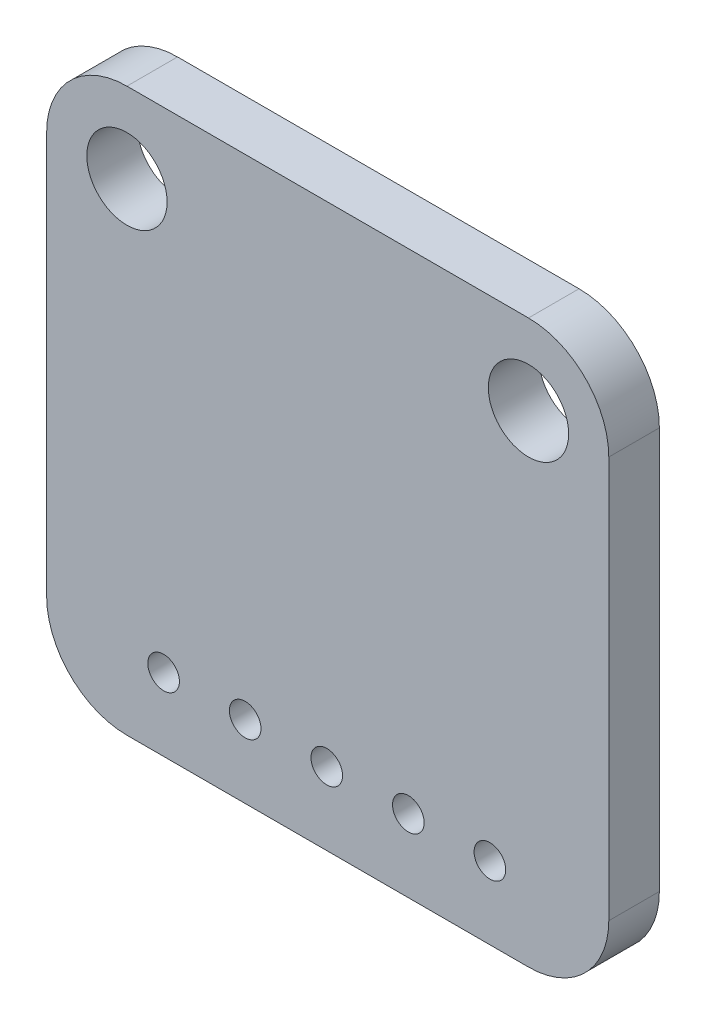
ISO-10303-21;
HEADER;
FILE_DESCRIPTION(('STEP AP214'),'2;1');
FILE_NAME('part.step','',(''),(''),'','','');
FILE_SCHEMA(('AUTOMOTIVE_DESIGN { 1 0 10303 214 1 1 1 1 }'));
ENDSEC;
DATA;
#1=APPLICATION_CONTEXT('core data for automotive mechanical design processes');
#2=APPLICATION_PROTOCOL_DEFINITION('international standard','automotive_design',2000,#1);
#3=PRODUCT_CONTEXT('',#1,'mechanical');
#4=PRODUCT('Part','Part','',(#3));
#5=PRODUCT_RELATED_PRODUCT_CATEGORY('part','',(#4));
#6=PRODUCT_DEFINITION_FORMATION('','',#4);
#7=PRODUCT_DEFINITION_CONTEXT('part definition',#1,'design');
#8=PRODUCT_DEFINITION('design','',#6,#7);
#9=PRODUCT_DEFINITION_SHAPE('','',#8);
#10=(LENGTH_UNIT() NAMED_UNIT(*) SI_UNIT(.MILLI.,.METRE.));
#11=(NAMED_UNIT(*) PLANE_ANGLE_UNIT() SI_UNIT($,.RADIAN.));
#12=(NAMED_UNIT(*) SI_UNIT($,.STERADIAN.) SOLID_ANGLE_UNIT());
#13=UNCERTAINTY_MEASURE_WITH_UNIT(LENGTH_MEASURE(1.E-05),#10,'distance_accuracy_value','');
#14=(GEOMETRIC_REPRESENTATION_CONTEXT(3) GLOBAL_UNCERTAINTY_ASSIGNED_CONTEXT((#13)) GLOBAL_UNIT_ASSIGNED_CONTEXT((#10,
#11,#12)) REPRESENTATION_CONTEXT('',''));
#15=CARTESIAN_POINT('',(0.,0.,0.));
#16=DIRECTION('',(0.,0.,1.));
#17=DIRECTION('',(1.,0.,0.));
#18=AXIS2_PLACEMENT_3D('',#15,#16,#17);
#19=CARTESIAN_POINT('',(6.35,6.35,1.6));
#20=DIRECTION('',(0.,0.,-1.));
#21=DIRECTION('',(-1.,0.,0.));
#22=AXIS2_PLACEMENT_3D('',#19,#20,#21);
#23=PLANE('',#22);
#24=CARTESIAN_POINT('',(-5.19,-6.59,1.6));
#25=DIRECTION('',(0.,0.,-1.));
#26=DIRECTION('',(-1.,0.,0.));
#27=AXIS2_PLACEMENT_3D('',#24,#25,#26);
#28=CIRCLE('',#27,0.500000000000002);
#29=CARTESIAN_POINT('',(-5.69,-6.59,1.6));
#30=VERTEX_POINT('',#29);
#31=EDGE_CURVE('E192',#30,#30,#28,.T.);
#32=ORIENTED_EDGE('',*,*,#31,.T.);
#33=EDGE_LOOP('',(#32));
#34=FACE_BOUND('',#33,.T.);
#35=CARTESIAN_POINT('',(-2.61,-6.59,1.6));
#36=DIRECTION('',(0.,0.,-1.));
#37=DIRECTION('',(-1.,0.,0.));
#38=AXIS2_PLACEMENT_3D('',#35,#36,#37);
#39=CIRCLE('',#38,0.500000000000002);
#40=CARTESIAN_POINT('',(-3.11,-6.59,1.6));
#41=VERTEX_POINT('',#40);
#42=EDGE_CURVE('E197',#41,#41,#39,.T.);
#43=ORIENTED_EDGE('',*,*,#42,.T.);
#44=EDGE_LOOP('',(#43));
#45=FACE_BOUND('',#44,.T.);
#46=CARTESIAN_POINT('',(-0.0299999999999979,-6.59,1.6));
#47=DIRECTION('',(0.,0.,-1.));
#48=DIRECTION('',(-1.,0.,0.));
#49=AXIS2_PLACEMENT_3D('',#46,#47,#48);
#50=CIRCLE('',#49,0.500000000000002);
#51=CARTESIAN_POINT('',(-0.53,-6.59,1.6));
#52=VERTEX_POINT('',#51);
#53=EDGE_CURVE('E200',#52,#52,#50,.T.);
#54=ORIENTED_EDGE('',*,*,#53,.T.);
#55=EDGE_LOOP('',(#54));
#56=FACE_BOUND('',#55,.T.);
#57=CARTESIAN_POINT('',(2.55,-6.59,1.6));
#58=DIRECTION('',(0.,0.,-1.));
#59=DIRECTION('',(-1.,0.,0.));
#60=AXIS2_PLACEMENT_3D('',#57,#58,#59);
#61=CIRCLE('',#60,0.500000000000002);
#62=CARTESIAN_POINT('',(2.05,-6.59,1.6));
#63=VERTEX_POINT('',#62);
#64=EDGE_CURVE('E203',#63,#63,#61,.T.);
#65=ORIENTED_EDGE('',*,*,#64,.T.);
#66=EDGE_LOOP('',(#65));
#67=FACE_BOUND('',#66,.T.);
#68=CARTESIAN_POINT('',(5.13,-6.59,1.6));
#69=DIRECTION('',(0.,0.,-1.));
#70=DIRECTION('',(-1.,0.,0.));
#71=AXIS2_PLACEMENT_3D('',#68,#69,#70);
#72=CIRCLE('',#71,0.500000000000002);
#73=CARTESIAN_POINT('',(4.63,-6.59,1.6));
#74=VERTEX_POINT('',#73);
#75=EDGE_CURVE('E206',#74,#74,#72,.T.);
#76=ORIENTED_EDGE('',*,*,#75,.T.);
#77=EDGE_LOOP('',(#76));
#78=FACE_BOUND('',#77,.T.);
#79=CARTESIAN_POINT('',(6.35,6.35,1.6));
#80=DIRECTION('',(0.,0.,1.));
#81=DIRECTION('',(-1.,0.,0.));
#82=AXIS2_PLACEMENT_3D('',#79,#80,#81);
#83=CIRCLE('',#82,2.54);
#84=CARTESIAN_POINT('',(8.89,6.34999999999998,1.6));
#85=VERTEX_POINT('',#84);
#86=CARTESIAN_POINT('',(6.34999999999998,8.89,1.6));
#87=VERTEX_POINT('',#86);
#88=EDGE_CURVE('E149',#85,#87,#83,.T.);
#89=ORIENTED_EDGE('',*,*,#88,.T.);
#90=DIRECTION('',(-1.,0.,0.));
#91=VECTOR('',#90,1.);
#92=CARTESIAN_POINT('',(-6.34999999999998,8.89,1.6));
#93=LINE('',#92,#91);
#94=CARTESIAN_POINT('',(-6.34999999999998,8.89,1.6));
#95=VERTEX_POINT('',#94);
#96=EDGE_CURVE('E97',#87,#95,#93,.T.);
#97=ORIENTED_EDGE('',*,*,#96,.T.);
#98=CARTESIAN_POINT('',(-6.35,6.35,1.6));
#99=DIRECTION('',(0.,0.,1.));
#100=DIRECTION('',(-1.,0.,0.));
#101=AXIS2_PLACEMENT_3D('',#98,#99,#100);
#102=CIRCLE('',#101,2.54);
#103=CARTESIAN_POINT('',(-8.89,6.34999999999998,1.6));
#104=VERTEX_POINT('',#103);
#105=EDGE_CURVE('E164',#95,#104,#102,.T.);
#106=ORIENTED_EDGE('',*,*,#105,.T.);
#107=DIRECTION('',(0.,-1.,0.));
#108=VECTOR('',#107,1.);
#109=CARTESIAN_POINT('',(-8.89,-6.34999999999998,1.6));
#110=LINE('',#109,#108);
#111=CARTESIAN_POINT('',(-8.89,-6.34999999999998,1.6));
#112=VERTEX_POINT('',#111);
#113=EDGE_CURVE('E177',#104,#112,#110,.T.);
#114=ORIENTED_EDGE('',*,*,#113,.T.);
#115=CARTESIAN_POINT('',(-6.35,-6.35,1.6));
#116=DIRECTION('',(0.,0.,1.));
#117=DIRECTION('',(-1.,0.,0.));
#118=AXIS2_PLACEMENT_3D('',#115,#116,#117);
#119=CIRCLE('',#118,2.54);
#120=CARTESIAN_POINT('',(-6.34999999999998,-8.89,1.6));
#121=VERTEX_POINT('',#120);
#122=EDGE_CURVE('E116',#112,#121,#119,.T.);
#123=ORIENTED_EDGE('',*,*,#122,.T.);
#124=DIRECTION('',(1.,0.,0.));
#125=VECTOR('',#124,1.);
#126=CARTESIAN_POINT('',(-6.34999999999998,-8.89,1.6));
#127=LINE('',#126,#125);
#128=CARTESIAN_POINT('',(6.34999999999998,-8.89,1.6));
#129=VERTEX_POINT('',#128);
#130=EDGE_CURVE('E110',#121,#129,#127,.T.);
#131=ORIENTED_EDGE('',*,*,#130,.T.);
#132=CARTESIAN_POINT('',(6.35,-6.35,1.6));
#133=DIRECTION('',(0.,0.,1.));
#134=DIRECTION('',(1.,0.,0.));
#135=AXIS2_PLACEMENT_3D('',#132,#133,#134);
#136=CIRCLE('',#135,2.54);
#137=CARTESIAN_POINT('',(8.89,-6.35,1.6));
#138=VERTEX_POINT('',#137);
#139=EDGE_CURVE('E114',#129,#138,#136,.T.);
#140=ORIENTED_EDGE('',*,*,#139,.T.);
#141=DIRECTION('',(0.,1.,0.));
#142=VECTOR('',#141,1.);
#143=CARTESIAN_POINT('',(8.89,-6.34999999999998,1.6));
#144=LINE('',#143,#142);
#145=EDGE_CURVE('E54',#138,#85,#144,.T.);
#146=ORIENTED_EDGE('',*,*,#145,.T.);
#147=EDGE_LOOP('',(#89,#97,#106,#114,#123,#131,#140,#146));
#148=FACE_BOUND('',#147,.T.);
#149=CARTESIAN_POINT('',(-6.35,6.35,1.6));
#150=DIRECTION('',(0.,0.,1.));
#151=DIRECTION('',(1.,0.,0.));
#152=AXIS2_PLACEMENT_3D('',#149,#150,#151);
#153=CIRCLE('',#152,1.27);
#154=CARTESIAN_POINT('',(-5.08,6.35,1.6));
#155=VERTEX_POINT('',#154);
#156=EDGE_CURVE('E138',#155,#155,#153,.T.);
#157=ORIENTED_EDGE('',*,*,#156,.F.);
#158=EDGE_LOOP('',(#157));
#159=FACE_BOUND('',#158,.T.);
#160=CARTESIAN_POINT('',(6.35,6.3500000000009,1.6));
#161=DIRECTION('',(0.,0.,1.));
#162=DIRECTION('',(1.,0.,0.));
#163=AXIS2_PLACEMENT_3D('',#160,#161,#162);
#164=CIRCLE('',#163,1.27000000000089);
#165=CARTESIAN_POINT('',(7.62000000000089,6.3500000000009,1.6));
#166=VERTEX_POINT('',#165);
#167=EDGE_CURVE('E186',#166,#166,#164,.T.);
#168=ORIENTED_EDGE('',*,*,#167,.F.);
#169=EDGE_LOOP('',(#168));
#170=FACE_BOUND('',#169,.T.);
#171=ADVANCED_FACE('F37',(#34,#45,#56,#67,#78,#148,#159,#170),#23,.F.);
#172=CARTESIAN_POINT('',(6.35,6.35,0.));
#173=DIRECTION('',(0.,0.,-1.));
#174=DIRECTION('',(-1.,0.,0.));
#175=AXIS2_PLACEMENT_3D('',#172,#173,#174);
#176=PLANE('',#175);
#177=CARTESIAN_POINT('',(-5.19,-6.59,0.));
#178=DIRECTION('',(0.,0.,1.));
#179=DIRECTION('',(1.,0.,0.));
#180=AXIS2_PLACEMENT_3D('',#177,#178,#179);
#181=CIRCLE('',#180,0.500000000000002);
#182=CARTESIAN_POINT('',(-4.69,-6.59,0.));
#183=VERTEX_POINT('',#182);
#184=EDGE_CURVE('E209',#183,#183,#181,.T.);
#185=ORIENTED_EDGE('',*,*,#184,.T.);
#186=EDGE_LOOP('',(#185));
#187=FACE_BOUND('',#186,.T.);
#188=CARTESIAN_POINT('',(-2.61,-6.59,0.));
#189=DIRECTION('',(0.,0.,1.));
#190=DIRECTION('',(1.,0.,0.));
#191=AXIS2_PLACEMENT_3D('',#188,#189,#190);
#192=CIRCLE('',#191,0.500000000000002);
#193=CARTESIAN_POINT('',(-2.11,-6.59,0.));
#194=VERTEX_POINT('',#193);
#195=EDGE_CURVE('E219',#194,#194,#192,.T.);
#196=ORIENTED_EDGE('',*,*,#195,.T.);
#197=EDGE_LOOP('',(#196));
#198=FACE_BOUND('',#197,.T.);
#199=CARTESIAN_POINT('',(-0.0299999999999979,-6.59,0.));
#200=DIRECTION('',(0.,0.,1.));
#201=DIRECTION('',(1.,0.,0.));
#202=AXIS2_PLACEMENT_3D('',#199,#200,#201);
#203=CIRCLE('',#202,0.500000000000002);
#204=CARTESIAN_POINT('',(0.470000000000004,-6.59,0.));
#205=VERTEX_POINT('',#204);
#206=EDGE_CURVE('E216',#205,#205,#203,.T.);
#207=ORIENTED_EDGE('',*,*,#206,.T.);
#208=EDGE_LOOP('',(#207));
#209=FACE_BOUND('',#208,.T.);
#210=CARTESIAN_POINT('',(2.55,-6.59,0.));
#211=DIRECTION('',(0.,0.,1.));
#212=DIRECTION('',(1.,0.,0.));
#213=AXIS2_PLACEMENT_3D('',#210,#211,#212);
#214=CIRCLE('',#213,0.500000000000002);
#215=CARTESIAN_POINT('',(3.05,-6.59,0.));
#216=VERTEX_POINT('',#215);
#217=EDGE_CURVE('E213',#216,#216,#214,.T.);
#218=ORIENTED_EDGE('',*,*,#217,.T.);
#219=EDGE_LOOP('',(#218));
#220=FACE_BOUND('',#219,.T.);
#221=CARTESIAN_POINT('',(5.13,-6.59,0.));
#222=DIRECTION('',(0.,0.,1.));
#223=DIRECTION('',(1.,0.,0.));
#224=AXIS2_PLACEMENT_3D('',#221,#222,#223);
#225=CIRCLE('',#224,0.500000000000002);
#226=CARTESIAN_POINT('',(5.63,-6.59,0.));
#227=VERTEX_POINT('',#226);
#228=EDGE_CURVE('E210',#227,#227,#225,.T.);
#229=ORIENTED_EDGE('',*,*,#228,.T.);
#230=EDGE_LOOP('',(#229));
#231=FACE_BOUND('',#230,.T.);
#232=CARTESIAN_POINT('',(-6.35,6.35,0.));
#233=DIRECTION('',(0.,0.,1.));
#234=DIRECTION('',(1.,0.,0.));
#235=AXIS2_PLACEMENT_3D('',#232,#233,#234);
#236=CIRCLE('',#235,1.27);
#237=CARTESIAN_POINT('',(-5.08,6.35,0.));
#238=VERTEX_POINT('',#237);
#239=EDGE_CURVE('E183',#238,#238,#236,.T.);
#240=ORIENTED_EDGE('',*,*,#239,.T.);
#241=EDGE_LOOP('',(#240));
#242=FACE_BOUND('',#241,.T.);
#243=CARTESIAN_POINT('',(6.35,6.35,0.));
#244=DIRECTION('',(0.,0.,1.));
#245=DIRECTION('',(-1.,0.,0.));
#246=AXIS2_PLACEMENT_3D('',#243,#244,#245);
#247=CIRCLE('',#246,2.54);
#248=CARTESIAN_POINT('',(8.89,6.34999999999998,0.));
#249=VERTEX_POINT('',#248);
#250=CARTESIAN_POINT('',(6.34999999999998,8.89,0.));
#251=VERTEX_POINT('',#250);
#252=EDGE_CURVE('E134',#249,#251,#247,.T.);
#253=ORIENTED_EDGE('',*,*,#252,.F.);
#254=DIRECTION('',(0.,1.,0.));
#255=VECTOR('',#254,1.);
#256=CARTESIAN_POINT('',(8.89,-6.34999999999998,0.));
#257=LINE('',#256,#255);
#258=CARTESIAN_POINT('',(8.89,-6.35,0.));
#259=VERTEX_POINT('',#258);
#260=EDGE_CURVE('E89',#259,#249,#257,.T.);
#261=ORIENTED_EDGE('',*,*,#260,.F.);
#262=CARTESIAN_POINT('',(6.35,-6.35,0.));
#263=DIRECTION('',(0.,0.,1.));
#264=DIRECTION('',(1.,0.,0.));
#265=AXIS2_PLACEMENT_3D('',#262,#263,#264);
#266=CIRCLE('',#265,2.54);
#267=CARTESIAN_POINT('',(6.34999999999998,-8.89,0.));
#268=VERTEX_POINT('',#267);
#269=EDGE_CURVE('E83',#268,#259,#266,.T.);
#270=ORIENTED_EDGE('',*,*,#269,.F.);
#271=DIRECTION('',(1.,0.,0.));
#272=VECTOR('',#271,1.);
#273=CARTESIAN_POINT('',(-6.34999999999998,-8.89,0.));
#274=LINE('',#273,#272);
#275=CARTESIAN_POINT('',(-6.34999999999998,-8.89,0.));
#276=VERTEX_POINT('',#275);
#277=EDGE_CURVE('E124',#276,#268,#274,.T.);
#278=ORIENTED_EDGE('',*,*,#277,.F.);
#279=CARTESIAN_POINT('',(-6.35,-6.35,0.));
#280=DIRECTION('',(0.,0.,1.));
#281=DIRECTION('',(-1.,0.,0.));
#282=AXIS2_PLACEMENT_3D('',#279,#280,#281);
#283=CIRCLE('',#282,2.54);
#284=CARTESIAN_POINT('',(-8.89,-6.34999999999998,0.));
#285=VERTEX_POINT('',#284);
#286=EDGE_CURVE('E144',#285,#276,#283,.T.);
#287=ORIENTED_EDGE('',*,*,#286,.F.);
#288=DIRECTION('',(0.,-1.,0.));
#289=VECTOR('',#288,1.);
#290=CARTESIAN_POINT('',(-8.89,-6.34999999999998,0.));
#291=LINE('',#290,#289);
#292=CARTESIAN_POINT('',(-8.89,6.34999999999998,0.));
#293=VERTEX_POINT('',#292);
#294=EDGE_CURVE('E142',#293,#285,#291,.T.);
#295=ORIENTED_EDGE('',*,*,#294,.F.);
#296=CARTESIAN_POINT('',(-6.35,6.35,0.));
#297=DIRECTION('',(0.,0.,1.));
#298=DIRECTION('',(-1.,0.,0.));
#299=AXIS2_PLACEMENT_3D('',#296,#297,#298);
#300=CIRCLE('',#299,2.54);
#301=CARTESIAN_POINT('',(-6.34999999999998,8.89,0.));
#302=VERTEX_POINT('',#301);
#303=EDGE_CURVE('E140',#302,#293,#300,.T.);
#304=ORIENTED_EDGE('',*,*,#303,.F.);
#305=DIRECTION('',(-1.,0.,0.));
#306=VECTOR('',#305,1.);
#307=CARTESIAN_POINT('',(-6.34999999999998,8.89,0.));
#308=LINE('',#307,#306);
#309=EDGE_CURVE('E137',#251,#302,#308,.T.);
#310=ORIENTED_EDGE('',*,*,#309,.F.);
#311=EDGE_LOOP('',(#253,#261,#270,#278,#287,#295,#304,#310));
#312=FACE_BOUND('',#311,.T.);
#313=CARTESIAN_POINT('',(6.35,6.3500000000009,0.));
#314=DIRECTION('',(0.,0.,1.));
#315=DIRECTION('',(1.,0.,0.));
#316=AXIS2_PLACEMENT_3D('',#313,#314,#315);
#317=CIRCLE('',#316,1.27000000000089);
#318=CARTESIAN_POINT('',(7.62000000000089,6.3500000000009,0.));
#319=VERTEX_POINT('',#318);
#320=EDGE_CURVE('E189',#319,#319,#317,.T.);
#321=ORIENTED_EDGE('',*,*,#320,.T.);
#322=EDGE_LOOP('',(#321));
#323=FACE_BOUND('',#322,.T.);
#324=ADVANCED_FACE('F168',(#187,#198,#209,#220,#231,#242,#312,#323),#176,.T.);
#325=CARTESIAN_POINT('',(6.35,6.35,1.6));
#326=DIRECTION('',(0.,0.,-1.));
#327=DIRECTION('',(-1.,0.,0.));
#328=AXIS2_PLACEMENT_3D('',#325,#326,#327);
#329=CYLINDRICAL_SURFACE('',#328,2.54);
#330=ORIENTED_EDGE('',*,*,#252,.T.);
#331=DIRECTION('',(0.,0.,-1.));
#332=VECTOR('',#331,1.);
#333=CARTESIAN_POINT('',(6.34999999999998,8.89,1.6));
#334=LINE('',#333,#332);
#335=EDGE_CURVE('E11',#87,#251,#334,.T.);
#336=ORIENTED_EDGE('',*,*,#335,.F.);
#337=ORIENTED_EDGE('',*,*,#88,.F.);
#338=DIRECTION('',(0.,0.,-1.));
#339=VECTOR('',#338,1.);
#340=CARTESIAN_POINT('',(8.89,6.34999999999998,1.6));
#341=LINE('',#340,#339);
#342=EDGE_CURVE('E130',#85,#249,#341,.T.);
#343=ORIENTED_EDGE('',*,*,#342,.T.);
#344=EDGE_LOOP('',(#330,#336,#337,#343));
#345=FACE_BOUND('',#344,.T.);
#346=ADVANCED_FACE('F39',(#345),#329,.T.);
#347=CARTESIAN_POINT('',(-6.34999999999998,8.89,1.6));
#348=DIRECTION('',(0.,-1.,0.));
#349=DIRECTION('',(0.,0.,-1.));
#350=AXIS2_PLACEMENT_3D('',#347,#348,#349);
#351=PLANE('',#350);
#352=ORIENTED_EDGE('',*,*,#309,.T.);
#353=DIRECTION('',(0.,0.,-1.));
#354=VECTOR('',#353,1.);
#355=CARTESIAN_POINT('',(-6.34999999999998,8.89,1.6));
#356=LINE('',#355,#354);
#357=EDGE_CURVE('E46',#95,#302,#356,.T.);
#358=ORIENTED_EDGE('',*,*,#357,.F.);
#359=ORIENTED_EDGE('',*,*,#96,.F.);
#360=ORIENTED_EDGE('',*,*,#335,.T.);
#361=EDGE_LOOP('',(#352,#358,#359,#360));
#362=FACE_BOUND('',#361,.T.);
#363=ADVANCED_FACE('F281',(#362),#351,.F.);
#364=CARTESIAN_POINT('',(-6.35,6.35,1.6));
#365=DIRECTION('',(0.,0.,-1.));
#366=DIRECTION('',(-1.,0.,0.));
#367=AXIS2_PLACEMENT_3D('',#364,#365,#366);
#368=CYLINDRICAL_SURFACE('',#367,2.54);
#369=ORIENTED_EDGE('',*,*,#303,.T.);
#370=DIRECTION('',(0.,0.,-1.));
#371=VECTOR('',#370,1.);
#372=CARTESIAN_POINT('',(-8.89,6.34999999999998,1.6));
#373=LINE('',#372,#371);
#374=EDGE_CURVE('E156',#104,#293,#373,.T.);
#375=ORIENTED_EDGE('',*,*,#374,.F.);
#376=ORIENTED_EDGE('',*,*,#105,.F.);
#377=ORIENTED_EDGE('',*,*,#357,.T.);
#378=EDGE_LOOP('',(#369,#375,#376,#377));
#379=FACE_BOUND('',#378,.T.);
#380=ADVANCED_FACE('F162',(#379),#368,.T.);
#381=CARTESIAN_POINT('',(-8.89,-6.34999999999998,1.6));
#382=DIRECTION('',(1.,0.,0.));
#383=DIRECTION('',(0.,0.,-1.));
#384=AXIS2_PLACEMENT_3D('',#381,#382,#383);
#385=PLANE('',#384);
#386=ORIENTED_EDGE('',*,*,#294,.T.);
#387=DIRECTION('',(0.,0.,-1.));
#388=VECTOR('',#387,1.);
#389=CARTESIAN_POINT('',(-8.89,-6.34999999999998,1.6));
#390=LINE('',#389,#388);
#391=EDGE_CURVE('E153',#112,#285,#390,.T.);
#392=ORIENTED_EDGE('',*,*,#391,.F.);
#393=ORIENTED_EDGE('',*,*,#113,.F.);
#394=ORIENTED_EDGE('',*,*,#374,.T.);
#395=EDGE_LOOP('',(#386,#392,#393,#394));
#396=FACE_BOUND('',#395,.T.);
#397=ADVANCED_FACE('F173',(#396),#385,.F.);
#398=CARTESIAN_POINT('',(-6.35,-6.35,1.6));
#399=DIRECTION('',(0.,0.,-1.));
#400=DIRECTION('',(-1.,0.,0.));
#401=AXIS2_PLACEMENT_3D('',#398,#399,#400);
#402=CYLINDRICAL_SURFACE('',#401,2.54);
#403=ORIENTED_EDGE('',*,*,#286,.T.);
#404=DIRECTION('',(0.,0.,-1.));
#405=VECTOR('',#404,1.);
#406=CARTESIAN_POINT('',(-6.34999999999998,-8.89,1.6));
#407=LINE('',#406,#405);
#408=EDGE_CURVE('E125',#121,#276,#407,.T.);
#409=ORIENTED_EDGE('',*,*,#408,.F.);
#410=ORIENTED_EDGE('',*,*,#122,.F.);
#411=ORIENTED_EDGE('',*,*,#391,.T.);
#412=EDGE_LOOP('',(#403,#409,#410,#411));
#413=FACE_BOUND('',#412,.T.);
#414=ADVANCED_FACE('F176',(#413),#402,.T.);
#415=CARTESIAN_POINT('',(-6.34999999999998,-8.89,1.6));
#416=DIRECTION('',(0.,1.,0.));
#417=DIRECTION('',(0.,0.,1.));
#418=AXIS2_PLACEMENT_3D('',#415,#416,#417);
#419=PLANE('',#418);
#420=ORIENTED_EDGE('',*,*,#277,.T.);
#421=DIRECTION('',(0.,0.,-1.));
#422=VECTOR('',#421,1.);
#423=CARTESIAN_POINT('',(6.34999999999998,-8.89,1.6));
#424=LINE('',#423,#422);
#425=EDGE_CURVE('E121',#129,#268,#424,.T.);
#426=ORIENTED_EDGE('',*,*,#425,.F.);
#427=ORIENTED_EDGE('',*,*,#130,.F.);
#428=ORIENTED_EDGE('',*,*,#408,.T.);
#429=EDGE_LOOP('',(#420,#426,#427,#428));
#430=FACE_BOUND('',#429,.T.);
#431=ADVANCED_FACE('F122',(#430),#419,.F.);
#432=CARTESIAN_POINT('',(6.35,-6.35,1.6));
#433=DIRECTION('',(0.,0.,-1.));
#434=DIRECTION('',(-1.,0.,0.));
#435=AXIS2_PLACEMENT_3D('',#432,#433,#434);
#436=CYLINDRICAL_SURFACE('',#435,2.54);
#437=ORIENTED_EDGE('',*,*,#269,.T.);
#438=DIRECTION('',(0.,0.,-1.));
#439=VECTOR('',#438,1.);
#440=CARTESIAN_POINT('',(8.89,-6.35,1.6));
#441=LINE('',#440,#439);
#442=EDGE_CURVE('E126',#138,#259,#441,.T.);
#443=ORIENTED_EDGE('',*,*,#442,.F.);
#444=ORIENTED_EDGE('',*,*,#139,.F.);
#445=ORIENTED_EDGE('',*,*,#425,.T.);
#446=EDGE_LOOP('',(#437,#443,#444,#445));
#447=FACE_BOUND('',#446,.T.);
#448=ADVANCED_FACE('F128',(#447),#436,.T.);
#449=CARTESIAN_POINT('',(8.89,-6.34999999999998,1.6));
#450=DIRECTION('',(-1.,0.,0.));
#451=DIRECTION('',(0.,0.,1.));
#452=AXIS2_PLACEMENT_3D('',#449,#450,#451);
#453=PLANE('',#452);
#454=ORIENTED_EDGE('',*,*,#260,.T.);
#455=ORIENTED_EDGE('',*,*,#342,.F.);
#456=ORIENTED_EDGE('',*,*,#145,.F.);
#457=ORIENTED_EDGE('',*,*,#442,.T.);
#458=EDGE_LOOP('',(#454,#455,#456,#457));
#459=FACE_BOUND('',#458,.T.);
#460=ADVANCED_FACE('F265',(#459),#453,.F.);
#461=CARTESIAN_POINT('',(-6.35,6.35,1.6));
#462=DIRECTION('',(0.,0.,-1.));
#463=DIRECTION('',(-1.,0.,0.));
#464=AXIS2_PLACEMENT_3D('',#461,#462,#463);
#465=CYLINDRICAL_SURFACE('',#464,1.27);
#466=ORIENTED_EDGE('',*,*,#156,.T.);
#467=EDGE_LOOP('',(#466));
#468=FACE_BOUND('',#467,.T.);
#469=ORIENTED_EDGE('',*,*,#239,.F.);
#470=EDGE_LOOP('',(#469));
#471=FACE_BOUND('',#470,.T.);
#472=ADVANCED_FACE('F258',(#468,#471),#465,.F.);
#473=CARTESIAN_POINT('',(6.35,6.3500000000009,1.6));
#474=DIRECTION('',(0.,0.,-1.));
#475=DIRECTION('',(-1.,0.,0.));
#476=AXIS2_PLACEMENT_3D('',#473,#474,#475);
#477=CYLINDRICAL_SURFACE('',#476,1.27000000000089);
#478=ORIENTED_EDGE('',*,*,#167,.T.);
#479=EDGE_LOOP('',(#478));
#480=FACE_BOUND('',#479,.T.);
#481=ORIENTED_EDGE('',*,*,#320,.F.);
#482=EDGE_LOOP('',(#481));
#483=FACE_BOUND('',#482,.T.);
#484=ADVANCED_FACE('F248',(#480,#483),#477,.F.);
#485=CARTESIAN_POINT('',(5.13,-6.59,0.));
#486=DIRECTION('',(0.,0.,1.));
#487=DIRECTION('',(1.,0.,0.));
#488=AXIS2_PLACEMENT_3D('',#485,#486,#487);
#489=CYLINDRICAL_SURFACE('',#488,0.500000000000002);
#490=ORIENTED_EDGE('',*,*,#228,.F.);
#491=EDGE_LOOP('',(#490));
#492=FACE_BOUND('',#491,.T.);
#493=ORIENTED_EDGE('',*,*,#75,.F.);
#494=EDGE_LOOP('',(#493));
#495=FACE_BOUND('',#494,.T.);
#496=ADVANCED_FACE('F245',(#492,#495),#489,.F.);
#497=CARTESIAN_POINT('',(2.55,-6.59,0.));
#498=DIRECTION('',(0.,0.,1.));
#499=DIRECTION('',(1.,0.,0.));
#500=AXIS2_PLACEMENT_3D('',#497,#498,#499);
#501=CYLINDRICAL_SURFACE('',#500,0.500000000000002);
#502=ORIENTED_EDGE('',*,*,#217,.F.);
#503=EDGE_LOOP('',(#502));
#504=FACE_BOUND('',#503,.T.);
#505=ORIENTED_EDGE('',*,*,#64,.F.);
#506=EDGE_LOOP('',(#505));
#507=FACE_BOUND('',#506,.T.);
#508=ADVANCED_FACE('F247',(#504,#507),#501,.F.);
#509=CARTESIAN_POINT('',(-0.0299999999999979,-6.59,0.));
#510=DIRECTION('',(0.,0.,1.));
#511=DIRECTION('',(1.,0.,0.));
#512=AXIS2_PLACEMENT_3D('',#509,#510,#511);
#513=CYLINDRICAL_SURFACE('',#512,0.500000000000002);
#514=ORIENTED_EDGE('',*,*,#206,.F.);
#515=EDGE_LOOP('',(#514));
#516=FACE_BOUND('',#515,.T.);
#517=ORIENTED_EDGE('',*,*,#53,.F.);
#518=EDGE_LOOP('',(#517));
#519=FACE_BOUND('',#518,.T.);
#520=ADVANCED_FACE('F255',(#516,#519),#513,.F.);
#521=CARTESIAN_POINT('',(-2.61,-6.59,0.));
#522=DIRECTION('',(0.,0.,1.));
#523=DIRECTION('',(1.,0.,0.));
#524=AXIS2_PLACEMENT_3D('',#521,#522,#523);
#525=CYLINDRICAL_SURFACE('',#524,0.500000000000002);
#526=ORIENTED_EDGE('',*,*,#195,.F.);
#527=EDGE_LOOP('',(#526));
#528=FACE_BOUND('',#527,.T.);
#529=ORIENTED_EDGE('',*,*,#42,.F.);
#530=EDGE_LOOP('',(#529));
#531=FACE_BOUND('',#530,.T.);
#532=ADVANCED_FACE('F230',(#528,#531),#525,.F.);
#533=CARTESIAN_POINT('',(-5.19,-6.59,0.));
#534=DIRECTION('',(0.,0.,1.));
#535=DIRECTION('',(1.,0.,0.));
#536=AXIS2_PLACEMENT_3D('',#533,#534,#535);
#537=CYLINDRICAL_SURFACE('',#536,0.500000000000002);
#538=ORIENTED_EDGE('',*,*,#184,.F.);
#539=EDGE_LOOP('',(#538));
#540=FACE_BOUND('',#539,.T.);
#541=ORIENTED_EDGE('',*,*,#31,.F.);
#542=EDGE_LOOP('',(#541));
#543=FACE_BOUND('',#542,.T.);
#544=ADVANCED_FACE('F227',(#540,#543),#537,.F.);
#545=CLOSED_SHELL('',(#171,#324,#346,#363,#380,#397,#414,#431,#448,#460,#472,#484,#496,#508,
#520,#532,#544));
#546=MANIFOLD_SOLID_BREP('B2',#545);
#547=ADVANCED_BREP_SHAPE_REPRESENTATION('',(#18,#546),#14);
#548=SHAPE_DEFINITION_REPRESENTATION(#9,#547);
ENDSEC;
END-ISO-10303-21;
